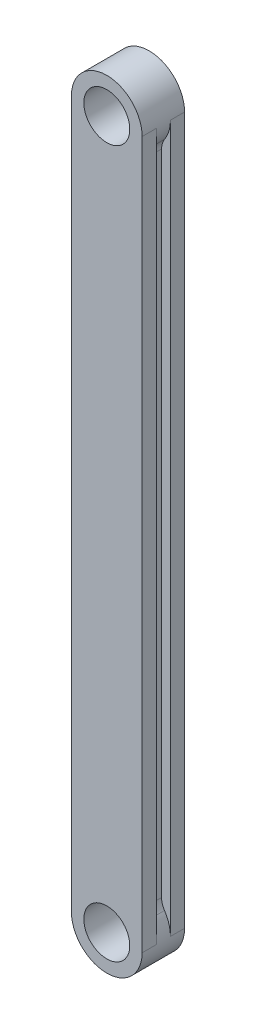
ISO-10303-21;
HEADER;
FILE_DESCRIPTION(('STEP AP214'),'2;1');
FILE_NAME('part.step','',(''),(''),'','','');
FILE_SCHEMA(('AUTOMOTIVE_DESIGN { 1 0 10303 214 1 1 1 1 }'));
ENDSEC;
DATA;
#1=APPLICATION_CONTEXT('core data for automotive mechanical design processes');
#2=APPLICATION_PROTOCOL_DEFINITION('international standard','automotive_design',2000,#1);
#3=PRODUCT_CONTEXT('',#1,'mechanical');
#4=PRODUCT('Part','Part','',(#3));
#5=PRODUCT_RELATED_PRODUCT_CATEGORY('part','',(#4));
#6=PRODUCT_DEFINITION_FORMATION('','',#4);
#7=PRODUCT_DEFINITION_CONTEXT('part definition',#1,'design');
#8=PRODUCT_DEFINITION('design','',#6,#7);
#9=PRODUCT_DEFINITION_SHAPE('','',#8);
#10=(LENGTH_UNIT() NAMED_UNIT(*) SI_UNIT(.MILLI.,.METRE.));
#11=(NAMED_UNIT(*) PLANE_ANGLE_UNIT() SI_UNIT($,.RADIAN.));
#12=(NAMED_UNIT(*) SI_UNIT($,.STERADIAN.) SOLID_ANGLE_UNIT());
#13=UNCERTAINTY_MEASURE_WITH_UNIT(LENGTH_MEASURE(1.E-05),#10,'distance_accuracy_value','');
#14=(GEOMETRIC_REPRESENTATION_CONTEXT(3) GLOBAL_UNCERTAINTY_ASSIGNED_CONTEXT((#13)) GLOBAL_UNIT_ASSIGNED_CONTEXT((#10,
#11,#12)) REPRESENTATION_CONTEXT('',''));
#15=CARTESIAN_POINT('',(0.,0.,0.));
#16=DIRECTION('',(0.,0.,1.));
#17=DIRECTION('',(1.,0.,0.));
#18=AXIS2_PLACEMENT_3D('',#15,#16,#17);
#19=CARTESIAN_POINT('',(15.,400.,-4.));
#20=DIRECTION('',(-1.,0.,0.));
#21=DIRECTION('',(0.,0.,1.));
#22=AXIS2_PLACEMENT_3D('',#19,#20,#21);
#23=PLANE('',#22);
#24=DIRECTION('',(0.,-1.,0.));
#25=VECTOR('',#24,1.);
#26=CARTESIAN_POINT('',(15.,400.,-4.));
#27=LINE('',#26,#25);
#28=CARTESIAN_POINT('',(15.,383.416876048223,-4.));
#29=VERTEX_POINT('',#28);
#30=CARTESIAN_POINT('',(15.,16.583123951777,-4.));
#31=VERTEX_POINT('',#30);
#32=EDGE_CURVE('E241',#29,#31,#27,.T.);
#33=ORIENTED_EDGE('',*,*,#32,.F.);
#34=DIRECTION('',(0.,0.,1.));
#35=VECTOR('',#34,1.);
#36=CARTESIAN_POINT('',(15.,383.416876048223,4.));
#37=LINE('',#36,#35);
#38=CARTESIAN_POINT('',(15.,383.416876048223,4.));
#39=VERTEX_POINT('',#38);
#40=EDGE_CURVE('E273',#29,#39,#37,.T.);
#41=ORIENTED_EDGE('',*,*,#40,.T.);
#42=DIRECTION('',(0.,-1.,0.));
#43=VECTOR('',#42,1.);
#44=CARTESIAN_POINT('',(15.,400.,4.));
#45=LINE('',#44,#43);
#46=CARTESIAN_POINT('',(15.,16.583123951777,4.));
#47=VERTEX_POINT('',#46);
#48=EDGE_CURVE('E244',#39,#47,#45,.T.);
#49=ORIENTED_EDGE('',*,*,#48,.T.);
#50=DIRECTION('',(0.,0.,-1.));
#51=VECTOR('',#50,1.);
#52=CARTESIAN_POINT('',(15.,16.583123951777,-4.));
#53=LINE('',#52,#51);
#54=EDGE_CURVE('E270',#47,#31,#53,.T.);
#55=ORIENTED_EDGE('',*,*,#54,.T.);
#56=EDGE_LOOP('',(#33,#41,#49,#55));
#57=FACE_BOUND('',#56,.T.);
#58=ADVANCED_FACE('F34',(#57),#23,.F.);
#59=CARTESIAN_POINT('',(-15.,400.,-4.));
#60=DIRECTION('',(1.,0.,0.));
#61=DIRECTION('',(0.,0.,-1.));
#62=AXIS2_PLACEMENT_3D('',#59,#60,#61);
#63=PLANE('',#62);
#64=DIRECTION('',(0.,-1.,0.));
#65=VECTOR('',#64,1.);
#66=CARTESIAN_POINT('',(-15.,400.,4.));
#67=LINE('',#66,#65);
#68=CARTESIAN_POINT('',(-15.,383.416876048223,4.));
#69=VERTEX_POINT('',#68);
#70=CARTESIAN_POINT('',(-15.,16.583123951777,4.));
#71=VERTEX_POINT('',#70);
#72=EDGE_CURVE('E223',#69,#71,#67,.T.);
#73=ORIENTED_EDGE('',*,*,#72,.F.);
#74=DIRECTION('',(0.,0.,1.));
#75=VECTOR('',#74,1.);
#76=CARTESIAN_POINT('',(-15.,383.416876048223,-3.99999999999999));
#77=LINE('',#76,#75);
#78=CARTESIAN_POINT('',(-15.,383.416876048223,-4.));
#79=VERTEX_POINT('',#78);
#80=EDGE_CURVE('E260',#69,#79,#77,.F.);
#81=ORIENTED_EDGE('',*,*,#80,.T.);
#82=DIRECTION('',(0.,-1.,0.));
#83=VECTOR('',#82,1.);
#84=CARTESIAN_POINT('',(-15.,400.,-4.));
#85=LINE('',#84,#83);
#86=CARTESIAN_POINT('',(-15.,16.583123951777,-4.));
#87=VERTEX_POINT('',#86);
#88=EDGE_CURVE('E226',#79,#87,#85,.T.);
#89=ORIENTED_EDGE('',*,*,#88,.T.);
#90=DIRECTION('',(0.,0.,-1.));
#91=VECTOR('',#90,1.);
#92=CARTESIAN_POINT('',(-15.,16.583123951777,-4.));
#93=LINE('',#92,#91);
#94=EDGE_CURVE('E257',#87,#71,#93,.F.);
#95=ORIENTED_EDGE('',*,*,#94,.T.);
#96=EDGE_LOOP('',(#73,#81,#89,#95));
#97=FACE_BOUND('',#96,.T.);
#98=ADVANCED_FACE('F290',(#97),#63,.F.);
#99=CARTESIAN_POINT('',(20.,400.,4.00000000000001));
#100=DIRECTION('',(-1.,0.,0.));
#101=DIRECTION('',(0.,0.,1.));
#102=AXIS2_PLACEMENT_3D('',#99,#100,#101);
#103=PLANE('',#102);
#104=DIRECTION('',(0.,0.,-1.));
#105=VECTOR('',#104,1.);
#106=CARTESIAN_POINT('',(20.,0.,4.00000000000001));
#107=LINE('',#106,#105);
#108=CARTESIAN_POINT('',(20.,0.,12.));
#109=VERTEX_POINT('',#108);
#110=CARTESIAN_POINT('',(20.,0.,4.00000000000001));
#111=VERTEX_POINT('',#110);
#112=EDGE_CURVE('E202',#109,#111,#107,.T.);
#113=ORIENTED_EDGE('',*,*,#112,.T.);
#114=DIRECTION('',(0.,-1.,0.));
#115=VECTOR('',#114,1.);
#116=CARTESIAN_POINT('',(20.,400.,4.00000000000001));
#117=LINE('',#116,#115);
#118=CARTESIAN_POINT('',(20.,400.,4.00000000000001));
#119=VERTEX_POINT('',#118);
#120=EDGE_CURVE('E154',#119,#111,#117,.T.);
#121=ORIENTED_EDGE('',*,*,#120,.F.);
#122=DIRECTION('',(0.,0.,-1.));
#123=VECTOR('',#122,1.);
#124=CARTESIAN_POINT('',(20.,400.,4.00000000000001));
#125=LINE('',#124,#123);
#126=CARTESIAN_POINT('',(20.,400.,12.));
#127=VERTEX_POINT('',#126);
#128=EDGE_CURVE('E148',#127,#119,#125,.T.);
#129=ORIENTED_EDGE('',*,*,#128,.F.);
#130=DIRECTION('',(0.,-1.,0.));
#131=VECTOR('',#130,1.);
#132=CARTESIAN_POINT('',(20.,400.,12.));
#133=LINE('',#132,#131);
#134=EDGE_CURVE('E152',#127,#109,#133,.T.);
#135=ORIENTED_EDGE('',*,*,#134,.T.);
#136=EDGE_LOOP('',(#113,#121,#129,#135));
#137=FACE_BOUND('',#136,.T.);
#138=ADVANCED_FACE('F151',(#137),#103,.F.);
#139=CARTESIAN_POINT('',(20.,400.,4.00000000000001));
#140=DIRECTION('',(0.,0.,1.));
#141=DIRECTION('',(1.,0.,0.));
#142=AXIS2_PLACEMENT_3D('',#139,#140,#141);
#143=PLANE('',#142);
#144=ORIENTED_EDGE('',*,*,#48,.F.);
#145=CARTESIAN_POINT('',(25.,383.416876048223,4.));
#146=DIRECTION('',(0.,0.,1.));
#147=DIRECTION('',(1.,0.,0.));
#148=AXIS2_PLACEMENT_3D('',#145,#146,#147);
#149=CIRCLE('',#148,10.);
#150=CARTESIAN_POINT('',(16.6666666666667,388.944584032149,4.00000000000001));
#151=VERTEX_POINT('',#150);
#152=EDGE_CURVE('E276',#39,#151,#149,.F.);
#153=ORIENTED_EDGE('',*,*,#152,.T.);
#154=CARTESIAN_POINT('',(0.,400.,3.99999999999999));
#155=DIRECTION('',(0.,0.,1.));
#156=DIRECTION('',(1.,0.,0.));
#157=AXIS2_PLACEMENT_3D('',#154,#155,#156);
#158=CIRCLE('',#157,20.);
#159=EDGE_CURVE('E186',#119,#151,#158,.F.);
#160=ORIENTED_EDGE('',*,*,#159,.F.);
#161=ORIENTED_EDGE('',*,*,#120,.T.);
#162=CARTESIAN_POINT('',(0.,0.,3.99999999999999));
#163=DIRECTION('',(0.,0.,1.));
#164=DIRECTION('',(1.,0.,0.));
#165=AXIS2_PLACEMENT_3D('',#162,#163,#164);
#166=CIRCLE('',#165,20.);
#167=CARTESIAN_POINT('',(16.6666666666667,11.0554159678513,4.00000000000001));
#168=VERTEX_POINT('',#167);
#169=EDGE_CURVE('E201',#111,#168,#166,.T.);
#170=ORIENTED_EDGE('',*,*,#169,.T.);
#171=CARTESIAN_POINT('',(25.,16.583123951777,4.));
#172=DIRECTION('',(0.,0.,1.));
#173=DIRECTION('',(1.,0.,0.));
#174=AXIS2_PLACEMENT_3D('',#171,#172,#173);
#175=CIRCLE('',#174,10.);
#176=EDGE_CURVE('E54',#168,#47,#175,.F.);
#177=ORIENTED_EDGE('',*,*,#176,.T.);
#178=EDGE_LOOP('',(#144,#153,#160,#161,#170,#177));
#179=FACE_BOUND('',#178,.T.);
#180=ADVANCED_FACE('F324',(#179),#143,.F.);
#181=CARTESIAN_POINT('',(20.,400.,-4.00000000000001));
#182=DIRECTION('',(0.,0.,-1.));
#183=DIRECTION('',(-1.,0.,0.));
#184=AXIS2_PLACEMENT_3D('',#181,#182,#183);
#185=PLANE('',#184);
#186=CARTESIAN_POINT('',(0.,400.,-3.99999999999998));
#187=DIRECTION('',(0.,0.,-1.));
#188=DIRECTION('',(-1.,0.,0.));
#189=AXIS2_PLACEMENT_3D('',#186,#187,#188);
#190=CIRCLE('',#189,20.);
#191=CARTESIAN_POINT('',(16.6666666666667,388.944584032149,-4.));
#192=VERTEX_POINT('',#191);
#193=CARTESIAN_POINT('',(20.,400.,-4.00000000000001));
#194=VERTEX_POINT('',#193);
#195=EDGE_CURVE('E188',#192,#194,#190,.F.);
#196=ORIENTED_EDGE('',*,*,#195,.F.);
#197=CARTESIAN_POINT('',(25.,383.416876048223,-4.));
#198=DIRECTION('',(0.,0.,-1.));
#199=DIRECTION('',(-1.,0.,0.));
#200=AXIS2_PLACEMENT_3D('',#197,#198,#199);
#201=CIRCLE('',#200,10.);
#202=EDGE_CURVE('E268',#192,#29,#201,.F.);
#203=ORIENTED_EDGE('',*,*,#202,.T.);
#204=ORIENTED_EDGE('',*,*,#32,.T.);
#205=CARTESIAN_POINT('',(25.,16.583123951777,-4.));
#206=DIRECTION('',(0.,0.,-1.));
#207=DIRECTION('',(-1.,0.,0.));
#208=AXIS2_PLACEMENT_3D('',#205,#206,#207);
#209=CIRCLE('',#208,10.);
#210=CARTESIAN_POINT('',(16.6666666666667,11.0554159678513,-4.));
#211=VERTEX_POINT('',#210);
#212=EDGE_CURVE('E266',#31,#211,#209,.F.);
#213=ORIENTED_EDGE('',*,*,#212,.T.);
#214=CARTESIAN_POINT('',(0.,0.,-3.99999999999998));
#215=DIRECTION('',(0.,0.,-1.));
#216=DIRECTION('',(-1.,0.,0.));
#217=AXIS2_PLACEMENT_3D('',#214,#215,#216);
#218=CIRCLE('',#217,20.);
#219=CARTESIAN_POINT('',(20.,0.,-4.));
#220=VERTEX_POINT('',#219);
#221=EDGE_CURVE('E199',#211,#220,#218,.T.);
#222=ORIENTED_EDGE('',*,*,#221,.T.);
#223=DIRECTION('',(0.,-1.,0.));
#224=VECTOR('',#223,1.);
#225=CARTESIAN_POINT('',(20.,400.,-4.00000000000001));
#226=LINE('',#225,#224);
#227=EDGE_CURVE('E238',#194,#220,#226,.T.);
#228=ORIENTED_EDGE('',*,*,#227,.F.);
#229=EDGE_LOOP('',(#196,#203,#204,#213,#222,#228));
#230=FACE_BOUND('',#229,.T.);
#231=ADVANCED_FACE('F314',(#230),#185,.F.);
#232=CARTESIAN_POINT('',(20.,400.,-12.));
#233=DIRECTION('',(-1.,0.,0.));
#234=DIRECTION('',(0.,0.,1.));
#235=AXIS2_PLACEMENT_3D('',#232,#233,#234);
#236=PLANE('',#235);
#237=DIRECTION('',(0.,0.,-1.));
#238=VECTOR('',#237,1.);
#239=CARTESIAN_POINT('',(20.,0.,-12.));
#240=LINE('',#239,#238);
#241=CARTESIAN_POINT('',(20.,0.,-12.));
#242=VERTEX_POINT('',#241);
#243=EDGE_CURVE('E211',#220,#242,#240,.T.);
#244=ORIENTED_EDGE('',*,*,#243,.T.);
#245=DIRECTION('',(0.,-1.,0.));
#246=VECTOR('',#245,1.);
#247=CARTESIAN_POINT('',(20.,400.,-12.));
#248=LINE('',#247,#246);
#249=CARTESIAN_POINT('',(20.,400.,-12.));
#250=VERTEX_POINT('',#249);
#251=EDGE_CURVE('E235',#250,#242,#248,.T.);
#252=ORIENTED_EDGE('',*,*,#251,.F.);
#253=DIRECTION('',(0.,0.,-1.));
#254=VECTOR('',#253,1.);
#255=CARTESIAN_POINT('',(20.,400.,-12.));
#256=LINE('',#255,#254);
#257=EDGE_CURVE('E158',#194,#250,#256,.T.);
#258=ORIENTED_EDGE('',*,*,#257,.F.);
#259=ORIENTED_EDGE('',*,*,#227,.T.);
#260=EDGE_LOOP('',(#244,#252,#258,#259));
#261=FACE_BOUND('',#260,.T.);
#262=ADVANCED_FACE('F309',(#261),#236,.F.);
#263=CARTESIAN_POINT('',(-20.,400.,-12.));
#264=DIRECTION('',(0.,0.,1.));
#265=DIRECTION('',(1.,0.,0.));
#266=AXIS2_PLACEMENT_3D('',#263,#264,#265);
#267=PLANE('',#266);
#268=CARTESIAN_POINT('',(0.,0.,-12.));
#269=DIRECTION('',(0.,0.,1.));
#270=DIRECTION('',(-1.,0.,0.));
#271=AXIS2_PLACEMENT_3D('',#268,#269,#270);
#272=CIRCLE('',#271,13.);
#273=CARTESIAN_POINT('',(-13.,0.,-12.));
#274=VERTEX_POINT('',#273);
#275=EDGE_CURVE('E508',#274,#274,#272,.T.);
#276=ORIENTED_EDGE('',*,*,#275,.T.);
#277=EDGE_LOOP('',(#276));
#278=FACE_BOUND('',#277,.T.);
#279=CARTESIAN_POINT('',(0.,400.,-12.));
#280=DIRECTION('',(0.,0.,-1.));
#281=DIRECTION('',(-1.,0.,0.));
#282=AXIS2_PLACEMENT_3D('',#279,#280,#281);
#283=CIRCLE('',#282,13.);
#284=CARTESIAN_POINT('',(-13.,400.,-12.));
#285=VERTEX_POINT('',#284);
#286=EDGE_CURVE('E510',#285,#285,#283,.T.);
#287=ORIENTED_EDGE('',*,*,#286,.F.);
#288=EDGE_LOOP('',(#287));
#289=FACE_BOUND('',#288,.T.);
#290=DIRECTION('',(0.,-1.,0.));
#291=VECTOR('',#290,1.);
#292=CARTESIAN_POINT('',(-20.,400.,-12.));
#293=LINE('',#292,#291);
#294=CARTESIAN_POINT('',(-20.,400.,-12.));
#295=VERTEX_POINT('',#294);
#296=CARTESIAN_POINT('',(-20.,0.,-12.));
#297=VERTEX_POINT('',#296);
#298=EDGE_CURVE('E232',#295,#297,#293,.T.);
#299=ORIENTED_EDGE('',*,*,#298,.F.);
#300=CARTESIAN_POINT('',(0.,400.,-12.));
#301=DIRECTION('',(0.,0.,1.));
#302=DIRECTION('',(-1.,0.,0.));
#303=AXIS2_PLACEMENT_3D('',#300,#301,#302);
#304=CIRCLE('',#303,20.);
#305=EDGE_CURVE('E176',#250,#295,#304,.T.);
#306=ORIENTED_EDGE('',*,*,#305,.F.);
#307=ORIENTED_EDGE('',*,*,#251,.T.);
#308=CARTESIAN_POINT('',(0.,0.,-12.));
#309=DIRECTION('',(0.,0.,-1.));
#310=DIRECTION('',(-1.,0.,0.));
#311=AXIS2_PLACEMENT_3D('',#308,#309,#310);
#312=CIRCLE('',#311,20.);
#313=EDGE_CURVE('E190',#242,#297,#312,.T.);
#314=ORIENTED_EDGE('',*,*,#313,.T.);
#315=EDGE_LOOP('',(#299,#306,#307,#314));
#316=FACE_BOUND('',#315,.T.);
#317=ADVANCED_FACE('F305',(#278,#289,#316),#267,.F.);
#318=CARTESIAN_POINT('',(-20.,400.,-12.));
#319=DIRECTION('',(1.,0.,0.));
#320=DIRECTION('',(0.,0.,-1.));
#321=AXIS2_PLACEMENT_3D('',#318,#319,#320);
#322=PLANE('',#321);
#323=DIRECTION('',(0.,0.,1.));
#324=VECTOR('',#323,1.);
#325=CARTESIAN_POINT('',(-20.,0.,-12.));
#326=LINE('',#325,#324);
#327=CARTESIAN_POINT('',(-20.,0.,-4.00000000000001));
#328=VERTEX_POINT('',#327);
#329=EDGE_CURVE('E214',#297,#328,#326,.T.);
#330=ORIENTED_EDGE('',*,*,#329,.T.);
#331=DIRECTION('',(0.,-1.,0.));
#332=VECTOR('',#331,1.);
#333=CARTESIAN_POINT('',(-20.,400.,-4.));
#334=LINE('',#333,#332);
#335=CARTESIAN_POINT('',(-20.,400.,-4.));
#336=VERTEX_POINT('',#335);
#337=EDGE_CURVE('E229',#336,#328,#334,.T.);
#338=ORIENTED_EDGE('',*,*,#337,.F.);
#339=DIRECTION('',(0.,0.,1.));
#340=VECTOR('',#339,1.);
#341=CARTESIAN_POINT('',(-20.,400.,-12.));
#342=LINE('',#341,#340);
#343=EDGE_CURVE('E206',#295,#336,#342,.T.);
#344=ORIENTED_EDGE('',*,*,#343,.F.);
#345=ORIENTED_EDGE('',*,*,#298,.T.);
#346=EDGE_LOOP('',(#330,#338,#344,#345));
#347=FACE_BOUND('',#346,.T.);
#348=ADVANCED_FACE('F302',(#347),#322,.F.);
#349=CARTESIAN_POINT('',(-20.,400.,-4.));
#350=DIRECTION('',(0.,0.,-1.));
#351=DIRECTION('',(-1.,0.,0.));
#352=AXIS2_PLACEMENT_3D('',#349,#350,#351);
#353=PLANE('',#352);
#354=ORIENTED_EDGE('',*,*,#88,.F.);
#355=CARTESIAN_POINT('',(-25.,383.416876048223,-4.));
#356=DIRECTION('',(0.,0.,-1.));
#357=DIRECTION('',(-1.,0.,0.));
#358=AXIS2_PLACEMENT_3D('',#355,#356,#357);
#359=CIRCLE('',#358,10.);
#360=CARTESIAN_POINT('',(-16.6666666666667,388.944584032149,-4.));
#361=VERTEX_POINT('',#360);
#362=EDGE_CURVE('E264',#79,#361,#359,.F.);
#363=ORIENTED_EDGE('',*,*,#362,.T.);
#364=CARTESIAN_POINT('',(0.,400.,-3.99999999999999));
#365=DIRECTION('',(0.,0.,-1.));
#366=DIRECTION('',(-1.,0.,0.));
#367=AXIS2_PLACEMENT_3D('',#364,#365,#366);
#368=CIRCLE('',#367,20.);
#369=EDGE_CURVE('E175',#336,#361,#368,.F.);
#370=ORIENTED_EDGE('',*,*,#369,.F.);
#371=ORIENTED_EDGE('',*,*,#337,.T.);
#372=CARTESIAN_POINT('',(0.,0.,-3.99999999999999));
#373=DIRECTION('',(0.,0.,-1.));
#374=DIRECTION('',(-1.,0.,0.));
#375=AXIS2_PLACEMENT_3D('',#372,#373,#374);
#376=CIRCLE('',#375,20.);
#377=CARTESIAN_POINT('',(-16.6666666666667,11.0554159678513,-4.));
#378=VERTEX_POINT('',#377);
#379=EDGE_CURVE('E196',#328,#378,#376,.T.);
#380=ORIENTED_EDGE('',*,*,#379,.T.);
#381=CARTESIAN_POINT('',(-25.,16.583123951777,-4.));
#382=DIRECTION('',(0.,0.,-1.));
#383=DIRECTION('',(-1.,0.,0.));
#384=AXIS2_PLACEMENT_3D('',#381,#382,#383);
#385=CIRCLE('',#384,10.);
#386=EDGE_CURVE('E262',#378,#87,#385,.F.);
#387=ORIENTED_EDGE('',*,*,#386,.T.);
#388=EDGE_LOOP('',(#354,#363,#370,#371,#380,#387));
#389=FACE_BOUND('',#388,.T.);
#390=ADVANCED_FACE('F285',(#389),#353,.F.);
#391=CARTESIAN_POINT('',(-20.,400.,4.));
#392=DIRECTION('',(0.,0.,1.));
#393=DIRECTION('',(1.,0.,0.));
#394=AXIS2_PLACEMENT_3D('',#391,#392,#393);
#395=PLANE('',#394);
#396=CARTESIAN_POINT('',(0.,400.,3.99999999999999));
#397=DIRECTION('',(0.,0.,1.));
#398=DIRECTION('',(1.,0.,0.));
#399=AXIS2_PLACEMENT_3D('',#396,#397,#398);
#400=CIRCLE('',#399,20.);
#401=CARTESIAN_POINT('',(-16.6666666666667,388.944584032149,4.));
#402=VERTEX_POINT('',#401);
#403=CARTESIAN_POINT('',(-20.,400.,4.));
#404=VERTEX_POINT('',#403);
#405=EDGE_CURVE('E178',#402,#404,#400,.F.);
#406=ORIENTED_EDGE('',*,*,#405,.F.);
#407=CARTESIAN_POINT('',(-25.,383.416876048223,4.));
#408=DIRECTION('',(0.,0.,1.));
#409=DIRECTION('',(1.,0.,0.));
#410=AXIS2_PLACEMENT_3D('',#407,#408,#409);
#411=CIRCLE('',#410,10.);
#412=EDGE_CURVE('E255',#402,#69,#411,.F.);
#413=ORIENTED_EDGE('',*,*,#412,.T.);
#414=ORIENTED_EDGE('',*,*,#72,.T.);
#415=CARTESIAN_POINT('',(-25.,16.583123951777,4.));
#416=DIRECTION('',(0.,0.,1.));
#417=DIRECTION('',(1.,0.,0.));
#418=AXIS2_PLACEMENT_3D('',#415,#416,#417);
#419=CIRCLE('',#418,10.);
#420=CARTESIAN_POINT('',(-16.6666666666667,11.0554159678513,4.));
#421=VERTEX_POINT('',#420);
#422=EDGE_CURVE('E253',#71,#421,#419,.F.);
#423=ORIENTED_EDGE('',*,*,#422,.T.);
#424=CARTESIAN_POINT('',(0.,0.,3.99999999999999));
#425=DIRECTION('',(0.,0.,1.));
#426=DIRECTION('',(1.,0.,0.));
#427=AXIS2_PLACEMENT_3D('',#424,#425,#426);
#428=CIRCLE('',#427,20.);
#429=CARTESIAN_POINT('',(-20.,0.,4.));
#430=VERTEX_POINT('',#429);
#431=EDGE_CURVE('E194',#421,#430,#428,.T.);
#432=ORIENTED_EDGE('',*,*,#431,.T.);
#433=DIRECTION('',(0.,-1.,0.));
#434=VECTOR('',#433,1.);
#435=CARTESIAN_POINT('',(-20.,400.,4.));
#436=LINE('',#435,#434);
#437=EDGE_CURVE('E220',#404,#430,#436,.T.);
#438=ORIENTED_EDGE('',*,*,#437,.F.);
#439=EDGE_LOOP('',(#406,#413,#414,#423,#432,#438));
#440=FACE_BOUND('',#439,.T.);
#441=ADVANCED_FACE('F294',(#440),#395,.F.);
#442=CARTESIAN_POINT('',(-20.,400.,4.));
#443=DIRECTION('',(1.,0.,0.));
#444=DIRECTION('',(0.,0.,-1.));
#445=AXIS2_PLACEMENT_3D('',#442,#443,#444);
#446=PLANE('',#445);
#447=DIRECTION('',(0.,0.,1.));
#448=VECTOR('',#447,1.);
#449=CARTESIAN_POINT('',(-20.,0.,4.));
#450=LINE('',#449,#448);
#451=CARTESIAN_POINT('',(-20.,0.,12.));
#452=VERTEX_POINT('',#451);
#453=EDGE_CURVE('E159',#430,#452,#450,.T.);
#454=ORIENTED_EDGE('',*,*,#453,.T.);
#455=DIRECTION('',(0.,-1.,0.));
#456=VECTOR('',#455,1.);
#457=CARTESIAN_POINT('',(-20.,400.,12.));
#458=LINE('',#457,#456);
#459=CARTESIAN_POINT('',(-20.,400.,12.));
#460=VERTEX_POINT('',#459);
#461=EDGE_CURVE('E168',#460,#452,#458,.T.);
#462=ORIENTED_EDGE('',*,*,#461,.F.);
#463=DIRECTION('',(0.,0.,1.));
#464=VECTOR('',#463,1.);
#465=CARTESIAN_POINT('',(-20.,400.,4.));
#466=LINE('',#465,#464);
#467=EDGE_CURVE('E169',#404,#460,#466,.T.);
#468=ORIENTED_EDGE('',*,*,#467,.F.);
#469=ORIENTED_EDGE('',*,*,#437,.T.);
#470=EDGE_LOOP('',(#454,#462,#468,#469));
#471=FACE_BOUND('',#470,.T.);
#472=ADVANCED_FACE('F326',(#471),#446,.F.);
#473=CARTESIAN_POINT('',(-20.,400.,12.));
#474=DIRECTION('',(0.,0.,-1.));
#475=DIRECTION('',(-1.,0.,0.));
#476=AXIS2_PLACEMENT_3D('',#473,#474,#475);
#477=PLANE('',#476);
#478=CARTESIAN_POINT('',(0.,0.,12.));
#479=DIRECTION('',(0.,0.,-1.));
#480=DIRECTION('',(-1.,0.,0.));
#481=AXIS2_PLACEMENT_3D('',#478,#479,#480);
#482=CIRCLE('',#481,13.);
#483=CARTESIAN_POINT('',(-13.,0.,12.));
#484=VERTEX_POINT('',#483);
#485=EDGE_CURVE('E513',#484,#484,#482,.T.);
#486=ORIENTED_EDGE('',*,*,#485,.T.);
#487=EDGE_LOOP('',(#486));
#488=FACE_BOUND('',#487,.T.);
#489=CARTESIAN_POINT('',(0.,400.,12.));
#490=DIRECTION('',(0.,0.,-1.));
#491=DIRECTION('',(-1.,0.,0.));
#492=AXIS2_PLACEMENT_3D('',#489,#490,#491);
#493=CIRCLE('',#492,13.);
#494=CARTESIAN_POINT('',(-13.,400.,12.));
#495=VERTEX_POINT('',#494);
#496=EDGE_CURVE('E181',#495,#495,#493,.F.);
#497=ORIENTED_EDGE('',*,*,#496,.F.);
#498=EDGE_LOOP('',(#497));
#499=FACE_BOUND('',#498,.T.);
#500=ORIENTED_EDGE('',*,*,#134,.F.);
#501=CARTESIAN_POINT('',(0.,400.,12.));
#502=DIRECTION('',(0.,0.,-1.));
#503=DIRECTION('',(-1.,0.,0.));
#504=AXIS2_PLACEMENT_3D('',#501,#502,#503);
#505=CIRCLE('',#504,20.);
#506=EDGE_CURVE('E165',#460,#127,#505,.T.);
#507=ORIENTED_EDGE('',*,*,#506,.F.);
#508=ORIENTED_EDGE('',*,*,#461,.T.);
#509=CARTESIAN_POINT('',(0.,0.,12.));
#510=DIRECTION('',(0.,0.,-1.));
#511=DIRECTION('',(-1.,0.,0.));
#512=AXIS2_PLACEMENT_3D('',#509,#510,#511);
#513=CIRCLE('',#512,20.);
#514=EDGE_CURVE('E166',#452,#109,#513,.F.);
#515=ORIENTED_EDGE('',*,*,#514,.T.);
#516=EDGE_LOOP('',(#500,#507,#508,#515));
#517=FACE_BOUND('',#516,.T.);
#518=ADVANCED_FACE('F163',(#488,#499,#517),#477,.F.);
#519=CARTESIAN_POINT('',(0.,0.,68.5685424949238));
#520=DIRECTION('',(0.,0.,-1.));
#521=DIRECTION('',(-1.,0.,0.));
#522=AXIS2_PLACEMENT_3D('',#519,#520,#521);
#523=CYLINDRICAL_SURFACE('',#522,20.);
#524=ORIENTED_EDGE('',*,*,#221,.F.);
#525=DIRECTION('',(0.,0.,-1.));
#526=VECTOR('',#525,1.);
#527=CARTESIAN_POINT('',(16.6666666666667,11.0554159678513,68.5685424949238));
#528=LINE('',#527,#526);
#529=EDGE_CURVE('E11',#211,#168,#528,.F.);
#530=ORIENTED_EDGE('',*,*,#529,.T.);
#531=ORIENTED_EDGE('',*,*,#169,.F.);
#532=ORIENTED_EDGE('',*,*,#112,.F.);
#533=ORIENTED_EDGE('',*,*,#514,.F.);
#534=ORIENTED_EDGE('',*,*,#453,.F.);
#535=ORIENTED_EDGE('',*,*,#431,.F.);
#536=DIRECTION('',(0.,0.,-1.));
#537=VECTOR('',#536,1.);
#538=CARTESIAN_POINT('',(-16.6666666666667,11.0554159678513,68.5685424949238));
#539=LINE('',#538,#537);
#540=EDGE_CURVE('E42',#421,#378,#539,.T.);
#541=ORIENTED_EDGE('',*,*,#540,.T.);
#542=ORIENTED_EDGE('',*,*,#379,.F.);
#543=ORIENTED_EDGE('',*,*,#329,.F.);
#544=ORIENTED_EDGE('',*,*,#313,.F.);
#545=ORIENTED_EDGE('',*,*,#243,.F.);
#546=EDGE_LOOP('',(#524,#530,#531,#532,#533,#534,#535,#541,#542,#543,#544,#545));
#547=FACE_BOUND('',#546,.T.);
#548=ADVANCED_FACE('F279',(#547),#523,.T.);
#549=CARTESIAN_POINT('',(0.,400.,68.5685424949238));
#550=DIRECTION('',(0.,0.,-1.));
#551=DIRECTION('',(-1.,0.,0.));
#552=AXIS2_PLACEMENT_3D('',#549,#550,#551);
#553=CYLINDRICAL_SURFACE('',#552,20.);
#554=ORIENTED_EDGE('',*,*,#369,.T.);
#555=DIRECTION('',(0.,0.,-1.));
#556=VECTOR('',#555,1.);
#557=CARTESIAN_POINT('',(-16.6666666666667,388.944584032149,68.5685424949238));
#558=LINE('',#557,#556);
#559=EDGE_CURVE('E250',#361,#402,#558,.F.);
#560=ORIENTED_EDGE('',*,*,#559,.T.);
#561=ORIENTED_EDGE('',*,*,#405,.T.);
#562=ORIENTED_EDGE('',*,*,#467,.T.);
#563=ORIENTED_EDGE('',*,*,#506,.T.);
#564=ORIENTED_EDGE('',*,*,#128,.T.);
#565=ORIENTED_EDGE('',*,*,#159,.T.);
#566=DIRECTION('',(0.,0.,-1.));
#567=VECTOR('',#566,1.);
#568=CARTESIAN_POINT('',(16.6666666666667,388.944584032149,68.5685424949238));
#569=LINE('',#568,#567);
#570=EDGE_CURVE('E247',#151,#192,#569,.T.);
#571=ORIENTED_EDGE('',*,*,#570,.T.);
#572=ORIENTED_EDGE('',*,*,#195,.T.);
#573=ORIENTED_EDGE('',*,*,#257,.T.);
#574=ORIENTED_EDGE('',*,*,#305,.T.);
#575=ORIENTED_EDGE('',*,*,#343,.T.);
#576=EDGE_LOOP('',(#554,#560,#561,#562,#563,#564,#565,#571,#572,#573,#574,#575));
#577=FACE_BOUND('',#576,.T.);
#578=ADVANCED_FACE('F173',(#577),#553,.T.);
#579=CARTESIAN_POINT('',(-25.,383.416876048223,68.5685424949238));
#580=DIRECTION('',(0.,0.,-1.));
#581=DIRECTION('',(-1.,0.,0.));
#582=AXIS2_PLACEMENT_3D('',#579,#580,#581);
#583=CYLINDRICAL_SURFACE('',#582,10.);
#584=ORIENTED_EDGE('',*,*,#362,.F.);
#585=ORIENTED_EDGE('',*,*,#80,.F.);
#586=ORIENTED_EDGE('',*,*,#412,.F.);
#587=ORIENTED_EDGE('',*,*,#559,.F.);
#588=EDGE_LOOP('',(#584,#585,#586,#587));
#589=FACE_BOUND('',#588,.T.);
#590=ADVANCED_FACE('F299',(#589),#583,.F.);
#591=CARTESIAN_POINT('',(25.,383.416876048223,68.5685424949238));
#592=DIRECTION('',(0.,0.,-1.));
#593=DIRECTION('',(-1.,0.,0.));
#594=AXIS2_PLACEMENT_3D('',#591,#592,#593);
#595=CYLINDRICAL_SURFACE('',#594,10.);
#596=ORIENTED_EDGE('',*,*,#152,.F.);
#597=ORIENTED_EDGE('',*,*,#40,.F.);
#598=ORIENTED_EDGE('',*,*,#202,.F.);
#599=ORIENTED_EDGE('',*,*,#570,.F.);
#600=EDGE_LOOP('',(#596,#597,#598,#599));
#601=FACE_BOUND('',#600,.T.);
#602=ADVANCED_FACE('F323',(#601),#595,.F.);
#603=CARTESIAN_POINT('',(25.,16.583123951777,68.5685424949238));
#604=DIRECTION('',(0.,0.,-1.));
#605=DIRECTION('',(-1.,0.,0.));
#606=AXIS2_PLACEMENT_3D('',#603,#604,#605);
#607=CYLINDRICAL_SURFACE('',#606,10.);
#608=ORIENTED_EDGE('',*,*,#176,.F.);
#609=ORIENTED_EDGE('',*,*,#529,.F.);
#610=ORIENTED_EDGE('',*,*,#212,.F.);
#611=ORIENTED_EDGE('',*,*,#54,.F.);
#612=EDGE_LOOP('',(#608,#609,#610,#611));
#613=FACE_BOUND('',#612,.T.);
#614=ADVANCED_FACE('F316',(#613),#607,.F.);
#615=CARTESIAN_POINT('',(-25.,16.583123951777,68.5685424949238));
#616=DIRECTION('',(0.,0.,-1.));
#617=DIRECTION('',(-1.,0.,0.));
#618=AXIS2_PLACEMENT_3D('',#615,#616,#617);
#619=CYLINDRICAL_SURFACE('',#618,10.);
#620=ORIENTED_EDGE('',*,*,#386,.F.);
#621=ORIENTED_EDGE('',*,*,#540,.F.);
#622=ORIENTED_EDGE('',*,*,#422,.F.);
#623=ORIENTED_EDGE('',*,*,#94,.F.);
#624=EDGE_LOOP('',(#620,#621,#622,#623));
#625=FACE_BOUND('',#624,.T.);
#626=ADVANCED_FACE('F36',(#625),#619,.F.);
#627=CARTESIAN_POINT('',(0.,400.,12.001));
#628=DIRECTION('',(0.,0.,-1.));
#629=DIRECTION('',(-1.,0.,0.));
#630=AXIS2_PLACEMENT_3D('',#627,#628,#629);
#631=CYLINDRICAL_SURFACE('',#630,13.);
#632=ORIENTED_EDGE('',*,*,#286,.T.);
#633=EDGE_LOOP('',(#632));
#634=FACE_BOUND('',#633,.T.);
#635=ORIENTED_EDGE('',*,*,#496,.T.);
#636=EDGE_LOOP('',(#635));
#637=FACE_BOUND('',#636,.T.);
#638=ADVANCED_FACE('F356',(#634,#637),#631,.F.);
#639=CARTESIAN_POINT('',(0.,0.,12.001));
#640=DIRECTION('',(0.,0.,-1.));
#641=DIRECTION('',(-1.,0.,0.));
#642=AXIS2_PLACEMENT_3D('',#639,#640,#641);
#643=CYLINDRICAL_SURFACE('',#642,13.);
#644=ORIENTED_EDGE('',*,*,#275,.F.);
#645=EDGE_LOOP('',(#644));
#646=FACE_BOUND('',#645,.T.);
#647=ORIENTED_EDGE('',*,*,#485,.F.);
#648=EDGE_LOOP('',(#647));
#649=FACE_BOUND('',#648,.T.);
#650=ADVANCED_FACE('F360',(#646,#649),#643,.F.);
#651=CLOSED_SHELL('',(#58,#98,#138,#180,#231,#262,#317,#348,#390,#441,#472,#518,#548,#578,#590,
#602,#614,#626,#638,#650));
#652=MANIFOLD_SOLID_BREP('B2',#651);
#653=ADVANCED_BREP_SHAPE_REPRESENTATION('',(#18,#652),#14);
#654=SHAPE_DEFINITION_REPRESENTATION(#9,#653);
ENDSEC;
END-ISO-10303-21;
